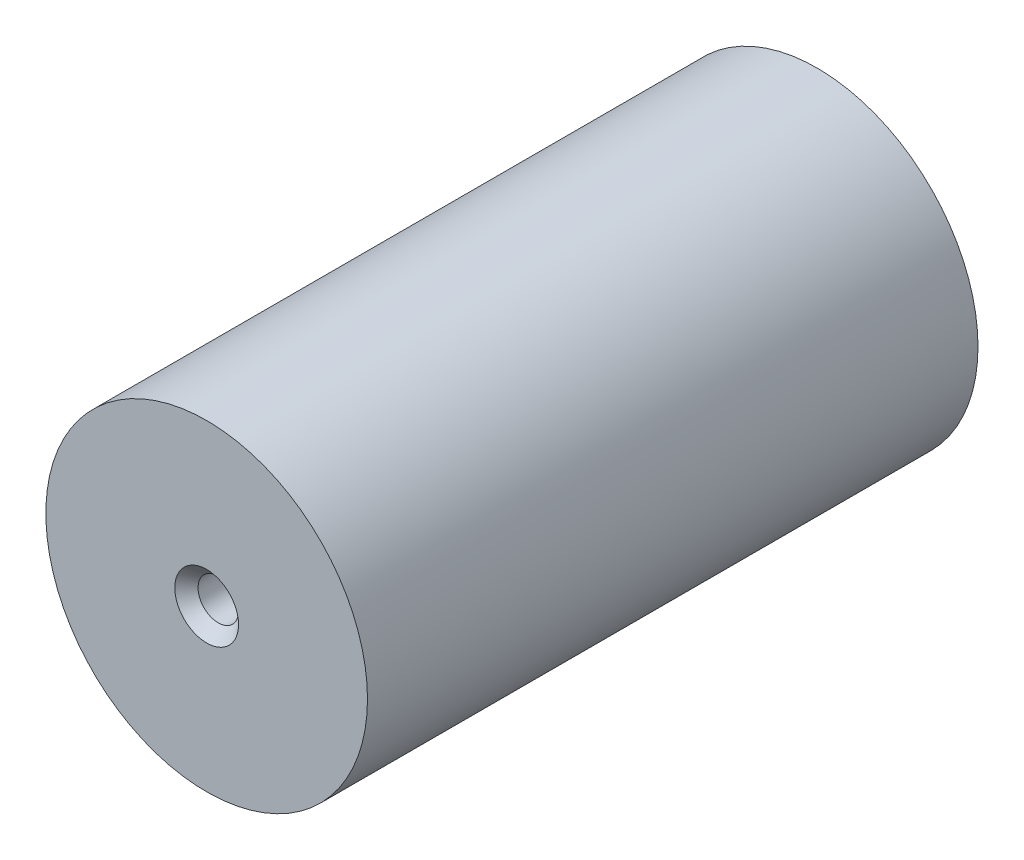
ISO-10303-21;
HEADER;
FILE_DESCRIPTION(('STEP AP214'),'2;1');
FILE_NAME('part.step','',(''),(''),'','','');
FILE_SCHEMA(('AUTOMOTIVE_DESIGN { 1 0 10303 214 1 1 1 1 }'));
ENDSEC;
DATA;
#1=APPLICATION_CONTEXT('core data for automotive mechanical design processes');
#2=APPLICATION_PROTOCOL_DEFINITION('international standard','automotive_design',2000,#1);
#3=PRODUCT_CONTEXT('',#1,'mechanical');
#4=PRODUCT('Part','Part','',(#3));
#5=PRODUCT_RELATED_PRODUCT_CATEGORY('part','',(#4));
#6=PRODUCT_DEFINITION_FORMATION('','',#4);
#7=PRODUCT_DEFINITION_CONTEXT('part definition',#1,'design');
#8=PRODUCT_DEFINITION('design','',#6,#7);
#9=PRODUCT_DEFINITION_SHAPE('','',#8);
#10=(LENGTH_UNIT() NAMED_UNIT(*) SI_UNIT(.MILLI.,.METRE.));
#11=(NAMED_UNIT(*) PLANE_ANGLE_UNIT() SI_UNIT($,.RADIAN.));
#12=(NAMED_UNIT(*) SI_UNIT($,.STERADIAN.) SOLID_ANGLE_UNIT());
#13=UNCERTAINTY_MEASURE_WITH_UNIT(LENGTH_MEASURE(1.E-05),#10,'distance_accuracy_value','');
#14=(GEOMETRIC_REPRESENTATION_CONTEXT(3) GLOBAL_UNCERTAINTY_ASSIGNED_CONTEXT((#13)) GLOBAL_UNIT_ASSIGNED_CONTEXT((#10,
#11,#12)) REPRESENTATION_CONTEXT('',''));
#15=CARTESIAN_POINT('',(0.,0.,0.));
#16=DIRECTION('',(0.,0.,1.));
#17=DIRECTION('',(1.,0.,0.));
#18=AXIS2_PLACEMENT_3D('',#15,#16,#17);
#19=CARTESIAN_POINT('',(0.,0.,52.07));
#20=DIRECTION('',(0.,0.,-1.));
#21=DIRECTION('',(-1.,0.,0.));
#22=AXIS2_PLACEMENT_3D('',#19,#20,#21);
#23=CYLINDRICAL_SURFACE('',#22,13.716);
#24=CARTESIAN_POINT('',(0.,0.,52.07));
#25=DIRECTION('',(0.,0.,1.));
#26=DIRECTION('',(1.,0.,0.));
#27=AXIS2_PLACEMENT_3D('',#24,#25,#26);
#28=CIRCLE('',#27,13.716);
#29=CARTESIAN_POINT('',(13.716,0.,52.07));
#30=VERTEX_POINT('',#29);
#31=EDGE_CURVE('E11',#30,#30,#28,.T.);
#32=ORIENTED_EDGE('',*,*,#31,.F.);
#33=EDGE_LOOP('',(#32));
#34=FACE_BOUND('',#33,.T.);
#35=CARTESIAN_POINT('',(0.,0.,0.));
#36=DIRECTION('',(0.,0.,1.));
#37=DIRECTION('',(1.,0.,0.));
#38=AXIS2_PLACEMENT_3D('',#35,#36,#37);
#39=CIRCLE('',#38,13.716);
#40=CARTESIAN_POINT('',(13.716,0.,0.));
#41=VERTEX_POINT('',#40);
#42=EDGE_CURVE('E42',#41,#41,#39,.T.);
#43=ORIENTED_EDGE('',*,*,#42,.T.);
#44=EDGE_LOOP('',(#43));
#45=FACE_BOUND('',#44,.T.);
#46=ADVANCED_FACE('F39',(#34,#45),#23,.T.);
#47=CARTESIAN_POINT('',(0.,0.,52.07));
#48=DIRECTION('',(0.,0.,1.));
#49=DIRECTION('',(1.,0.,0.));
#50=AXIS2_PLACEMENT_3D('',#47,#48,#49);
#51=PLANE('',#50);
#52=CARTESIAN_POINT('',(0.,0.,52.07));
#53=DIRECTION('',(0.,0.,1.));
#54=DIRECTION('',(1.,0.,0.));
#55=AXIS2_PLACEMENT_3D('',#52,#53,#54);
#56=CIRCLE('',#55,2.7178);
#57=CARTESIAN_POINT('',(2.7178,0.,52.07));
#58=VERTEX_POINT('',#57);
#59=EDGE_CURVE('E62',#58,#58,#56,.T.);
#60=ORIENTED_EDGE('',*,*,#59,.F.);
#61=EDGE_LOOP('',(#60));
#62=FACE_BOUND('',#61,.T.);
#63=ORIENTED_EDGE('',*,*,#31,.T.);
#64=EDGE_LOOP('',(#63));
#65=FACE_BOUND('',#64,.T.);
#66=ADVANCED_FACE('F70',(#62,#65),#51,.T.);
#67=CARTESIAN_POINT('',(0.,0.,0.));
#68=DIRECTION('',(0.,0.,1.));
#69=DIRECTION('',(1.,0.,0.));
#70=AXIS2_PLACEMENT_3D('',#67,#68,#69);
#71=PLANE('',#70);
#72=ORIENTED_EDGE('',*,*,#42,.F.);
#73=EDGE_LOOP('',(#72));
#74=FACE_BOUND('',#73,.T.);
#75=ADVANCED_FACE('F52',(#74),#71,.F.);
#76=CARTESIAN_POINT('',(0.,0.,39.37));
#77=DIRECTION('',(0.,0.,1.));
#78=DIRECTION('',(1.,0.,0.));
#79=AXIS2_PLACEMENT_3D('',#76,#77,#78);
#80=CONICAL_SURFACE('',#79,1.7272,1.02974425867665);
#81=CARTESIAN_POINT('',(0.,0.,38.3321935388156));
#82=VERTEX_POINT('',#81);
#83=VERTEX_LOOP('',#82);
#84=FACE_BOUND('',#83,.T.);
#85=CARTESIAN_POINT('',(0.,0.,39.37));
#86=DIRECTION('',(0.,0.,1.));
#87=DIRECTION('',(1.,0.,0.));
#88=AXIS2_PLACEMENT_3D('',#85,#86,#87);
#89=CIRCLE('',#88,1.7272);
#90=CARTESIAN_POINT('',(1.7272,0.,39.37));
#91=VERTEX_POINT('',#90);
#92=EDGE_CURVE('E56',#91,#91,#89,.T.);
#93=ORIENTED_EDGE('',*,*,#92,.T.);
#94=EDGE_LOOP('',(#93));
#95=FACE_BOUND('',#94,.T.);
#96=ADVANCED_FACE('F48',(#84,#95),#80,.F.);
#97=CARTESIAN_POINT('',(0.,0.,52.07));
#98=DIRECTION('',(0.,0.,1.));
#99=DIRECTION('',(1.,0.,0.));
#100=AXIS2_PLACEMENT_3D('',#97,#98,#99);
#101=CYLINDRICAL_SURFACE('',#100,1.7272);
#102=ORIENTED_EDGE('',*,*,#92,.F.);
#103=EDGE_LOOP('',(#102));
#104=FACE_BOUND('',#103,.T.);
#105=CARTESIAN_POINT('',(0.,0.,51.0794));
#106=DIRECTION('',(0.,0.,1.));
#107=DIRECTION('',(1.,0.,0.));
#108=AXIS2_PLACEMENT_3D('',#105,#106,#107);
#109=CIRCLE('',#108,1.7272);
#110=CARTESIAN_POINT('',(1.7272,0.,51.0794));
#111=VERTEX_POINT('',#110);
#112=EDGE_CURVE('E58',#111,#111,#109,.T.);
#113=ORIENTED_EDGE('',*,*,#112,.T.);
#114=EDGE_LOOP('',(#113));
#115=FACE_BOUND('',#114,.T.);
#116=ADVANCED_FACE('F51',(#104,#115),#101,.F.);
#117=CARTESIAN_POINT('',(0.,0.,52.07));
#118=DIRECTION('',(0.,0.,1.));
#119=DIRECTION('',(1.,0.,0.));
#120=AXIS2_PLACEMENT_3D('',#117,#118,#119);
#121=CONICAL_SURFACE('',#120,2.7178,0.785398163397448);
#122=ORIENTED_EDGE('',*,*,#112,.F.);
#123=EDGE_LOOP('',(#122));
#124=FACE_BOUND('',#123,.T.);
#125=ORIENTED_EDGE('',*,*,#59,.T.);
#126=EDGE_LOOP('',(#125));
#127=FACE_BOUND('',#126,.T.);
#128=ADVANCED_FACE('F68',(#124,#127),#121,.F.);
#129=CLOSED_SHELL('',(#46,#66,#75,#96,#116,#128));
#130=MANIFOLD_SOLID_BREP('B2',#129);
#131=ADVANCED_BREP_SHAPE_REPRESENTATION('',(#18,#130),#14);
#132=SHAPE_DEFINITION_REPRESENTATION(#9,#131);
ENDSEC;
END-ISO-10303-21;
